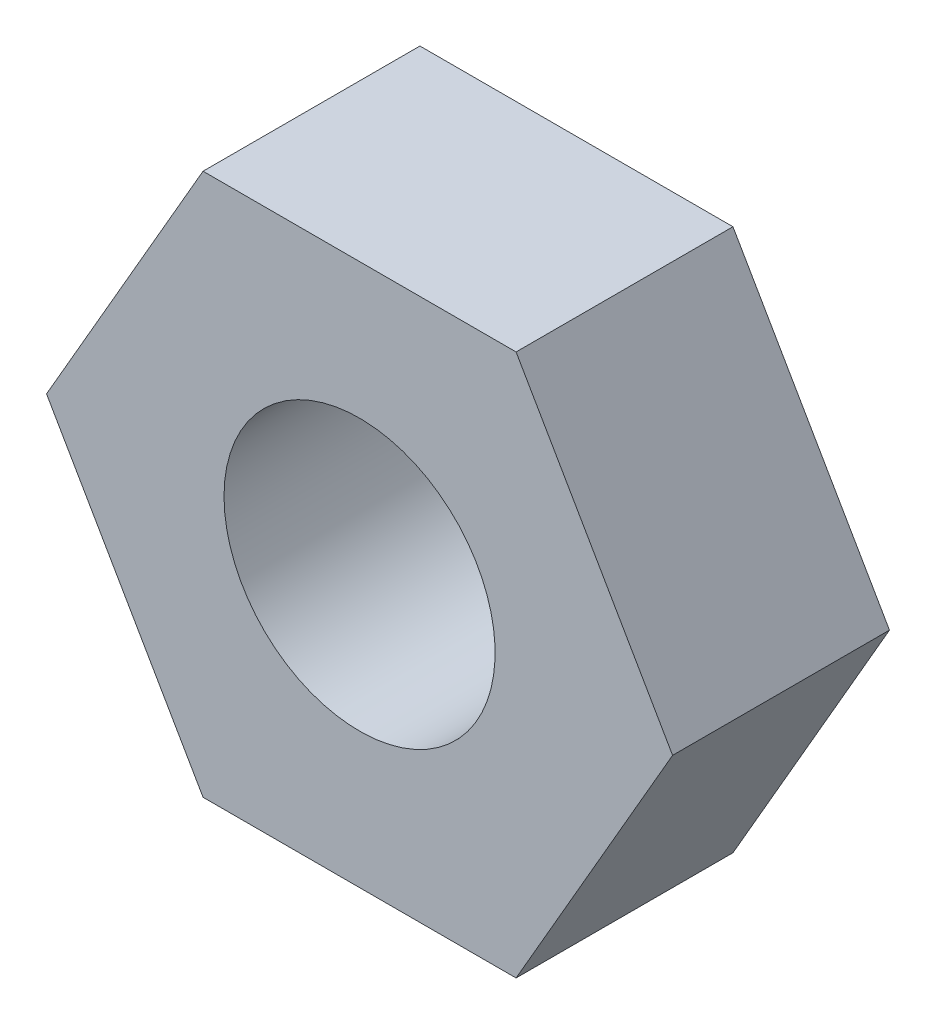
ISO-10303-21;
HEADER;
FILE_DESCRIPTION(('STEP AP214'),'2;1');
FILE_NAME('part.step','',(''),(''),'','','');
FILE_SCHEMA(('AUTOMOTIVE_DESIGN { 1 0 10303 214 1 1 1 1 }'));
ENDSEC;
DATA;
#1=APPLICATION_CONTEXT('core data for automotive mechanical design processes');
#2=APPLICATION_PROTOCOL_DEFINITION('international standard','automotive_design',2000,#1);
#3=PRODUCT_CONTEXT('',#1,'mechanical');
#4=PRODUCT('Part','Part','',(#3));
#5=PRODUCT_RELATED_PRODUCT_CATEGORY('part','',(#4));
#6=PRODUCT_DEFINITION_FORMATION('','',#4);
#7=PRODUCT_DEFINITION_CONTEXT('part definition',#1,'design');
#8=PRODUCT_DEFINITION('design','',#6,#7);
#9=PRODUCT_DEFINITION_SHAPE('','',#8);
#10=(LENGTH_UNIT() NAMED_UNIT(*) SI_UNIT(.MILLI.,.METRE.));
#11=(NAMED_UNIT(*) PLANE_ANGLE_UNIT() SI_UNIT($,.RADIAN.));
#12=(NAMED_UNIT(*) SI_UNIT($,.STERADIAN.) SOLID_ANGLE_UNIT());
#13=UNCERTAINTY_MEASURE_WITH_UNIT(LENGTH_MEASURE(1.E-05),#10,'distance_accuracy_value','');
#14=(GEOMETRIC_REPRESENTATION_CONTEXT(3) GLOBAL_UNCERTAINTY_ASSIGNED_CONTEXT((#13)) GLOBAL_UNIT_ASSIGNED_CONTEXT((#10,
#11,#12)) REPRESENTATION_CONTEXT('',''));
#15=CARTESIAN_POINT('',(0.,0.,0.));
#16=DIRECTION('',(0.,0.,1.));
#17=DIRECTION('',(1.,0.,0.));
#18=AXIS2_PLACEMENT_3D('',#15,#16,#17);
#19=CARTESIAN_POINT('',(1.15470053837925,-2.,1.6));
#20=DIRECTION('',(-0.866025403784439,0.5,0.));
#21=DIRECTION('',(-0.5,-0.866025403784439,0.));
#22=AXIS2_PLACEMENT_3D('',#19,#20,#21);
#23=PLANE('',#22);
#24=DIRECTION('',(0.5,0.866025403784439,0.));
#25=VECTOR('',#24,1.);
#26=CARTESIAN_POINT('',(1.15470053837925,-2.,0.));
#27=LINE('',#26,#25);
#28=CARTESIAN_POINT('',(1.15470053837925,-2.,0.));
#29=VERTEX_POINT('',#28);
#30=CARTESIAN_POINT('',(2.3094010767585,0.,0.));
#31=VERTEX_POINT('',#30);
#32=EDGE_CURVE('E128',#29,#31,#27,.T.);
#33=ORIENTED_EDGE('',*,*,#32,.T.);
#34=DIRECTION('',(0.,0.,-1.));
#35=VECTOR('',#34,1.);
#36=CARTESIAN_POINT('',(2.3094010767585,0.,1.6));
#37=LINE('',#36,#35);
#38=CARTESIAN_POINT('',(2.3094010767585,0.,1.6));
#39=VERTEX_POINT('',#38);
#40=EDGE_CURVE('E11',#39,#31,#37,.T.);
#41=ORIENTED_EDGE('',*,*,#40,.F.);
#42=DIRECTION('',(0.5,0.866025403784439,0.));
#43=VECTOR('',#42,1.);
#44=CARTESIAN_POINT('',(1.15470053837925,-2.,1.6));
#45=LINE('',#44,#43);
#46=CARTESIAN_POINT('',(1.15470053837925,-2.,1.6));
#47=VERTEX_POINT('',#46);
#48=EDGE_CURVE('E145',#47,#39,#45,.T.);
#49=ORIENTED_EDGE('',*,*,#48,.F.);
#50=DIRECTION('',(0.,0.,-1.));
#51=VECTOR('',#50,1.);
#52=CARTESIAN_POINT('',(1.15470053837925,-2.,1.6));
#53=LINE('',#52,#51);
#54=EDGE_CURVE('E124',#47,#29,#53,.T.);
#55=ORIENTED_EDGE('',*,*,#54,.T.);
#56=EDGE_LOOP('',(#33,#41,#49,#55));
#57=FACE_BOUND('',#56,.T.);
#58=ADVANCED_FACE('F39',(#57),#23,.F.);
#59=CARTESIAN_POINT('',(2.3094010767585,0.,1.6));
#60=DIRECTION('',(-0.866025403784439,-0.5,0.));
#61=DIRECTION('',(0.5,-0.866025403784439,0.));
#62=AXIS2_PLACEMENT_3D('',#59,#60,#61);
#63=PLANE('',#62);
#64=DIRECTION('',(-0.5,0.866025403784439,0.));
#65=VECTOR('',#64,1.);
#66=CARTESIAN_POINT('',(2.3094010767585,0.,0.));
#67=LINE('',#66,#65);
#68=CARTESIAN_POINT('',(1.15470053837925,2.,0.));
#69=VERTEX_POINT('',#68);
#70=EDGE_CURVE('E132',#31,#69,#67,.T.);
#71=ORIENTED_EDGE('',*,*,#70,.T.);
#72=DIRECTION('',(0.,0.,-1.));
#73=VECTOR('',#72,1.);
#74=CARTESIAN_POINT('',(1.15470053837925,2.,1.6));
#75=LINE('',#74,#73);
#76=CARTESIAN_POINT('',(1.15470053837925,2.,1.6));
#77=VERTEX_POINT('',#76);
#78=EDGE_CURVE('E48',#77,#69,#75,.T.);
#79=ORIENTED_EDGE('',*,*,#78,.F.);
#80=DIRECTION('',(-0.5,0.866025403784439,0.));
#81=VECTOR('',#80,1.);
#82=CARTESIAN_POINT('',(2.3094010767585,0.,1.6));
#83=LINE('',#82,#81);
#84=EDGE_CURVE('E93',#39,#77,#83,.T.);
#85=ORIENTED_EDGE('',*,*,#84,.F.);
#86=ORIENTED_EDGE('',*,*,#40,.T.);
#87=EDGE_LOOP('',(#71,#79,#85,#86));
#88=FACE_BOUND('',#87,.T.);
#89=ADVANCED_FACE('F174',(#88),#63,.F.);
#90=CARTESIAN_POINT('',(1.15470053837925,2.,1.6));
#91=DIRECTION('',(0.,-1.,0.));
#92=DIRECTION('',(1.,0.,0.));
#93=AXIS2_PLACEMENT_3D('',#90,#91,#92);
#94=PLANE('',#93);
#95=DIRECTION('',(-1.,0.,0.));
#96=VECTOR('',#95,1.);
#97=CARTESIAN_POINT('',(1.15470053837925,2.,0.));
#98=LINE('',#97,#96);
#99=CARTESIAN_POINT('',(-1.15470053837925,2.,0.));
#100=VERTEX_POINT('',#99);
#101=EDGE_CURVE('E136',#69,#100,#98,.T.);
#102=ORIENTED_EDGE('',*,*,#101,.T.);
#103=DIRECTION('',(0.,0.,-1.));
#104=VECTOR('',#103,1.);
#105=CARTESIAN_POINT('',(-1.15470053837925,2.,1.6));
#106=LINE('',#105,#104);
#107=CARTESIAN_POINT('',(-1.15470053837925,2.,1.6));
#108=VERTEX_POINT('',#107);
#109=EDGE_CURVE('E117',#108,#100,#106,.T.);
#110=ORIENTED_EDGE('',*,*,#109,.F.);
#111=DIRECTION('',(-1.,0.,0.));
#112=VECTOR('',#111,1.);
#113=CARTESIAN_POINT('',(1.15470053837925,2.,1.6));
#114=LINE('',#113,#112);
#115=EDGE_CURVE('E106',#77,#108,#114,.T.);
#116=ORIENTED_EDGE('',*,*,#115,.F.);
#117=ORIENTED_EDGE('',*,*,#78,.T.);
#118=EDGE_LOOP('',(#102,#110,#116,#117));
#119=FACE_BOUND('',#118,.T.);
#120=ADVANCED_FACE('F155',(#119),#94,.F.);
#121=CARTESIAN_POINT('',(-1.15470053837925,2.,1.6));
#122=DIRECTION('',(0.866025403784439,-0.5,0.));
#123=DIRECTION('',(0.5,0.866025403784439,0.));
#124=AXIS2_PLACEMENT_3D('',#121,#122,#123);
#125=PLANE('',#124);
#126=DIRECTION('',(-0.5,-0.866025403784439,0.));
#127=VECTOR('',#126,1.);
#128=CARTESIAN_POINT('',(-1.15470053837925,2.,0.));
#129=LINE('',#128,#127);
#130=CARTESIAN_POINT('',(-2.3094010767585,0.,0.));
#131=VERTEX_POINT('',#130);
#132=EDGE_CURVE('E115',#100,#131,#129,.T.);
#133=ORIENTED_EDGE('',*,*,#132,.T.);
#134=DIRECTION('',(0.,0.,-1.));
#135=VECTOR('',#134,1.);
#136=CARTESIAN_POINT('',(-2.3094010767585,0.,1.6));
#137=LINE('',#136,#135);
#138=CARTESIAN_POINT('',(-2.3094010767585,0.,1.6));
#139=VERTEX_POINT('',#138);
#140=EDGE_CURVE('E112',#139,#131,#137,.T.);
#141=ORIENTED_EDGE('',*,*,#140,.F.);
#142=DIRECTION('',(-0.5,-0.866025403784439,0.));
#143=VECTOR('',#142,1.);
#144=CARTESIAN_POINT('',(-1.15470053837925,2.,1.6));
#145=LINE('',#144,#143);
#146=EDGE_CURVE('E100',#108,#139,#145,.T.);
#147=ORIENTED_EDGE('',*,*,#146,.F.);
#148=ORIENTED_EDGE('',*,*,#109,.T.);
#149=EDGE_LOOP('',(#133,#141,#147,#148));
#150=FACE_BOUND('',#149,.T.);
#151=ADVANCED_FACE('F113',(#150),#125,.F.);
#152=CARTESIAN_POINT('',(-2.3094010767585,0.,1.6));
#153=DIRECTION('',(0.866025403784439,0.5,0.));
#154=DIRECTION('',(-0.5,0.866025403784439,0.));
#155=AXIS2_PLACEMENT_3D('',#152,#153,#154);
#156=PLANE('',#155);
#157=DIRECTION('',(0.5,-0.866025403784439,0.));
#158=VECTOR('',#157,1.);
#159=CARTESIAN_POINT('',(-2.3094010767585,0.,0.));
#160=LINE('',#159,#158);
#161=CARTESIAN_POINT('',(-1.15470053837925,-2.,0.));
#162=VERTEX_POINT('',#161);
#163=EDGE_CURVE('E79',#131,#162,#160,.T.);
#164=ORIENTED_EDGE('',*,*,#163,.T.);
#165=DIRECTION('',(0.,0.,-1.));
#166=VECTOR('',#165,1.);
#167=CARTESIAN_POINT('',(-1.15470053837925,-2.,1.6));
#168=LINE('',#167,#166);
#169=CARTESIAN_POINT('',(-1.15470053837925,-2.,1.6));
#170=VERTEX_POINT('',#169);
#171=EDGE_CURVE('E118',#170,#162,#168,.T.);
#172=ORIENTED_EDGE('',*,*,#171,.F.);
#173=DIRECTION('',(0.5,-0.866025403784439,0.));
#174=VECTOR('',#173,1.);
#175=CARTESIAN_POINT('',(-2.3094010767585,0.,1.6));
#176=LINE('',#175,#174);
#177=EDGE_CURVE('E104',#139,#170,#176,.T.);
#178=ORIENTED_EDGE('',*,*,#177,.F.);
#179=ORIENTED_EDGE('',*,*,#140,.T.);
#180=EDGE_LOOP('',(#164,#172,#178,#179));
#181=FACE_BOUND('',#180,.T.);
#182=ADVANCED_FACE('F120',(#181),#156,.F.);
#183=CARTESIAN_POINT('',(-1.15470053837925,-2.,1.6));
#184=DIRECTION('',(0.,1.,0.));
#185=DIRECTION('',(-1.,0.,0.));
#186=AXIS2_PLACEMENT_3D('',#183,#184,#185);
#187=PLANE('',#186);
#188=DIRECTION('',(1.,0.,0.));
#189=VECTOR('',#188,1.);
#190=CARTESIAN_POINT('',(-1.15470053837925,-2.,0.));
#191=LINE('',#190,#189);
#192=EDGE_CURVE('E85',#162,#29,#191,.T.);
#193=ORIENTED_EDGE('',*,*,#192,.T.);
#194=ORIENTED_EDGE('',*,*,#54,.F.);
#195=DIRECTION('',(1.,0.,0.));
#196=VECTOR('',#195,1.);
#197=CARTESIAN_POINT('',(-1.15470053837925,-2.,1.6));
#198=LINE('',#197,#196);
#199=EDGE_CURVE('E56',#170,#47,#198,.T.);
#200=ORIENTED_EDGE('',*,*,#199,.F.);
#201=ORIENTED_EDGE('',*,*,#171,.T.);
#202=EDGE_LOOP('',(#193,#194,#200,#201));
#203=FACE_BOUND('',#202,.T.);
#204=ADVANCED_FACE('F162',(#203),#187,.F.);
#205=CARTESIAN_POINT('',(0.,0.,1.6));
#206=DIRECTION('',(0.,0.,1.));
#207=DIRECTION('',(1.,0.,0.));
#208=AXIS2_PLACEMENT_3D('',#205,#206,#207);
#209=PLANE('',#208);
#210=CARTESIAN_POINT('',(0.,0.,1.6));
#211=DIRECTION('',(0.,0.,-1.));
#212=DIRECTION('',(-1.,0.,0.));
#213=AXIS2_PLACEMENT_3D('',#210,#211,#212);
#214=CIRCLE('',#213,1.);
#215=CARTESIAN_POINT('',(-1.,0.,1.6));
#216=VERTEX_POINT('',#215);
#217=EDGE_CURVE('E133',#216,#216,#214,.T.);
#218=ORIENTED_EDGE('',*,*,#217,.T.);
#219=EDGE_LOOP('',(#218));
#220=FACE_BOUND('',#219,.T.);
#221=ORIENTED_EDGE('',*,*,#48,.T.);
#222=ORIENTED_EDGE('',*,*,#84,.T.);
#223=ORIENTED_EDGE('',*,*,#115,.T.);
#224=ORIENTED_EDGE('',*,*,#146,.T.);
#225=ORIENTED_EDGE('',*,*,#177,.T.);
#226=ORIENTED_EDGE('',*,*,#199,.T.);
#227=EDGE_LOOP('',(#221,#222,#223,#224,#225,#226));
#228=FACE_BOUND('',#227,.T.);
#229=ADVANCED_FACE('F102',(#220,#228),#209,.T.);
#230=CARTESIAN_POINT('',(0.,0.,0.));
#231=DIRECTION('',(0.,0.,1.));
#232=DIRECTION('',(1.,0.,0.));
#233=AXIS2_PLACEMENT_3D('',#230,#231,#232);
#234=PLANE('',#233);
#235=CARTESIAN_POINT('',(0.,0.,0.));
#236=DIRECTION('',(0.,0.,-1.));
#237=DIRECTION('',(-1.,0.,0.));
#238=AXIS2_PLACEMENT_3D('',#235,#236,#237);
#239=CIRCLE('',#238,1.);
#240=CARTESIAN_POINT('',(-1.,0.,0.));
#241=VERTEX_POINT('',#240);
#242=EDGE_CURVE('E229',#241,#241,#239,.T.);
#243=ORIENTED_EDGE('',*,*,#242,.F.);
#244=EDGE_LOOP('',(#243));
#245=FACE_BOUND('',#244,.T.);
#246=ORIENTED_EDGE('',*,*,#32,.F.);
#247=ORIENTED_EDGE('',*,*,#192,.F.);
#248=ORIENTED_EDGE('',*,*,#163,.F.);
#249=ORIENTED_EDGE('',*,*,#132,.F.);
#250=ORIENTED_EDGE('',*,*,#101,.F.);
#251=ORIENTED_EDGE('',*,*,#70,.F.);
#252=EDGE_LOOP('',(#246,#247,#248,#249,#250,#251));
#253=FACE_BOUND('',#252,.T.);
#254=ADVANCED_FACE('F158',(#245,#253),#234,.F.);
#255=CARTESIAN_POINT('',(0.,0.,1.6));
#256=DIRECTION('',(0.,0.,-1.));
#257=DIRECTION('',(-1.,0.,0.));
#258=AXIS2_PLACEMENT_3D('',#255,#256,#257);
#259=CYLINDRICAL_SURFACE('',#258,1.);
#260=ORIENTED_EDGE('',*,*,#217,.F.);
#261=EDGE_LOOP('',(#260));
#262=FACE_BOUND('',#261,.T.);
#263=ORIENTED_EDGE('',*,*,#242,.T.);
#264=EDGE_LOOP('',(#263));
#265=FACE_BOUND('',#264,.T.);
#266=ADVANCED_FACE('F211',(#262,#265),#259,.F.);
#267=CLOSED_SHELL('',(#58,#89,#120,#151,#182,#204,#229,#254,#266));
#268=MANIFOLD_SOLID_BREP('B2',#267);
#269=ADVANCED_BREP_SHAPE_REPRESENTATION('',(#18,#268),#14);
#270=SHAPE_DEFINITION_REPRESENTATION(#9,#269);
ENDSEC;
END-ISO-10303-21;
